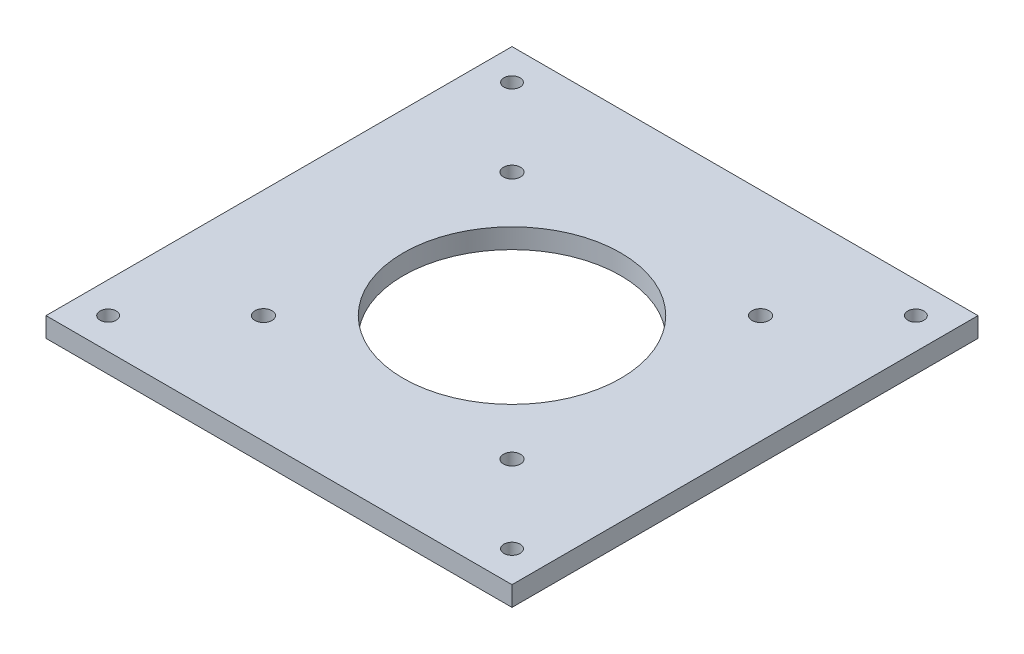
ISO-10303-21;
HEADER;
FILE_DESCRIPTION(('STEP AP214'),'2;1');
FILE_NAME('part.step','',(''),(''),'','','');
FILE_SCHEMA(('AUTOMOTIVE_DESIGN { 1 0 10303 214 1 1 1 1 }'));
ENDSEC;
DATA;
#1=APPLICATION_CONTEXT('core data for automotive mechanical design processes');
#2=APPLICATION_PROTOCOL_DEFINITION('international standard','automotive_design',2000,#1);
#3=PRODUCT_CONTEXT('',#1,'mechanical');
#4=PRODUCT('Part','Part','',(#3));
#5=PRODUCT_RELATED_PRODUCT_CATEGORY('part','',(#4));
#6=PRODUCT_DEFINITION_FORMATION('','',#4);
#7=PRODUCT_DEFINITION_CONTEXT('part definition',#1,'design');
#8=PRODUCT_DEFINITION('design','',#6,#7);
#9=PRODUCT_DEFINITION_SHAPE('','',#8);
#10=(LENGTH_UNIT() NAMED_UNIT(*) SI_UNIT(.MILLI.,.METRE.));
#11=(NAMED_UNIT(*) PLANE_ANGLE_UNIT() SI_UNIT($,.RADIAN.));
#12=(NAMED_UNIT(*) SI_UNIT($,.STERADIAN.) SOLID_ANGLE_UNIT());
#13=UNCERTAINTY_MEASURE_WITH_UNIT(LENGTH_MEASURE(1.E-05),#10,'distance_accuracy_value','');
#14=(GEOMETRIC_REPRESENTATION_CONTEXT(3) GLOBAL_UNCERTAINTY_ASSIGNED_CONTEXT((#13)) GLOBAL_UNIT_ASSIGNED_CONTEXT((#10,
#11,#12)) REPRESENTATION_CONTEXT('',''));
#15=CARTESIAN_POINT('',(0.,0.,0.));
#16=DIRECTION('',(0.,0.,1.));
#17=DIRECTION('',(1.,0.,0.));
#18=AXIS2_PLACEMENT_3D('',#15,#16,#17);
#19=CARTESIAN_POINT('',(0.,6.35,0.));
#20=DIRECTION('',(0.,1.,0.));
#21=DIRECTION('',(0.,0.,1.));
#22=AXIS2_PLACEMENT_3D('',#19,#20,#21);
#23=PLANE('',#22);
#24=CARTESIAN_POINT('',(-40.,6.35,40.));
#25=DIRECTION('',(0.,1.,0.));
#26=DIRECTION('',(0.,0.,-1.));
#27=AXIS2_PLACEMENT_3D('',#24,#25,#26);
#28=CIRCLE('',#27,2.74999999999999);
#29=CARTESIAN_POINT('',(-40.,6.35,37.25));
#30=VERTEX_POINT('',#29);
#31=EDGE_CURVE('E151',#30,#30,#28,.T.);
#32=ORIENTED_EDGE('',*,*,#31,.F.);
#33=EDGE_LOOP('',(#32));
#34=FACE_BOUND('',#33,.T.);
#35=CARTESIAN_POINT('',(40.,6.35,-40.));
#36=DIRECTION('',(0.,1.,0.));
#37=DIRECTION('',(0.,0.,-1.));
#38=AXIS2_PLACEMENT_3D('',#35,#36,#37);
#39=CIRCLE('',#38,2.75);
#40=CARTESIAN_POINT('',(40.,6.35,-42.75));
#41=VERTEX_POINT('',#40);
#42=EDGE_CURVE('E139',#41,#41,#39,.T.);
#43=ORIENTED_EDGE('',*,*,#42,.F.);
#44=EDGE_LOOP('',(#43));
#45=FACE_BOUND('',#44,.T.);
#46=CARTESIAN_POINT('',(-65.,6.35,65.));
#47=DIRECTION('',(0.,1.,0.));
#48=DIRECTION('',(0.,0.,-1.));
#49=AXIS2_PLACEMENT_3D('',#46,#47,#48);
#50=CIRCLE('',#49,2.59999999999999);
#51=CARTESIAN_POINT('',(-65.,6.35,62.4));
#52=VERTEX_POINT('',#51);
#53=EDGE_CURVE('E127',#52,#52,#50,.T.);
#54=ORIENTED_EDGE('',*,*,#53,.F.);
#55=EDGE_LOOP('',(#54));
#56=FACE_BOUND('',#55,.T.);
#57=CARTESIAN_POINT('',(65.,6.35,-65.));
#58=DIRECTION('',(0.,1.,0.));
#59=DIRECTION('',(0.,0.,-1.));
#60=AXIS2_PLACEMENT_3D('',#57,#58,#59);
#61=CIRCLE('',#60,2.59999999999999);
#62=CARTESIAN_POINT('',(65.,6.35,-67.6));
#63=VERTEX_POINT('',#62);
#64=EDGE_CURVE('E115',#63,#63,#61,.T.);
#65=ORIENTED_EDGE('',*,*,#64,.F.);
#66=EDGE_LOOP('',(#65));
#67=FACE_BOUND('',#66,.T.);
#68=DIRECTION('',(0.,0.,1.));
#69=VECTOR('',#68,1.);
#70=CARTESIAN_POINT('',(-75.,6.35,75.));
#71=LINE('',#70,#69);
#72=CARTESIAN_POINT('',(-75.,6.35,-75.));
#73=VERTEX_POINT('',#72);
#74=CARTESIAN_POINT('',(-75.,6.35,75.));
#75=VERTEX_POINT('',#74);
#76=EDGE_CURVE('E85',#73,#75,#71,.T.);
#77=ORIENTED_EDGE('',*,*,#76,.T.);
#78=DIRECTION('',(1.,0.,0.));
#79=VECTOR('',#78,1.);
#80=CARTESIAN_POINT('',(75.,6.35,75.));
#81=LINE('',#80,#79);
#82=CARTESIAN_POINT('',(75.,6.35,75.));
#83=VERTEX_POINT('',#82);
#84=EDGE_CURVE('E80',#75,#83,#81,.T.);
#85=ORIENTED_EDGE('',*,*,#84,.T.);
#86=DIRECTION('',(0.,0.,-1.));
#87=VECTOR('',#86,1.);
#88=CARTESIAN_POINT('',(75.,6.35,75.));
#89=LINE('',#88,#87);
#90=CARTESIAN_POINT('',(75.,6.35,-75.));
#91=VERTEX_POINT('',#90);
#92=EDGE_CURVE('E83',#83,#91,#89,.T.);
#93=ORIENTED_EDGE('',*,*,#92,.T.);
#94=DIRECTION('',(-1.,0.,0.));
#95=VECTOR('',#94,1.);
#96=CARTESIAN_POINT('',(75.,6.35,-75.));
#97=LINE('',#96,#95);
#98=EDGE_CURVE('E50',#91,#73,#97,.T.);
#99=ORIENTED_EDGE('',*,*,#98,.T.);
#100=EDGE_LOOP('',(#77,#85,#93,#99));
#101=FACE_BOUND('',#100,.T.);
#102=CARTESIAN_POINT('',(-65.,6.35,-65.));
#103=DIRECTION('',(0.,1.,0.));
#104=DIRECTION('',(0.,0.,1.));
#105=AXIS2_PLACEMENT_3D('',#102,#103,#104);
#106=CIRCLE('',#105,2.59999999999999);
#107=CARTESIAN_POINT('',(-65.,6.35,-62.4));
#108=VERTEX_POINT('',#107);
#109=EDGE_CURVE('E100',#108,#108,#106,.T.);
#110=ORIENTED_EDGE('',*,*,#109,.F.);
#111=EDGE_LOOP('',(#110));
#112=FACE_BOUND('',#111,.T.);
#113=CARTESIAN_POINT('',(65.,6.35,65.));
#114=DIRECTION('',(0.,1.,0.));
#115=DIRECTION('',(0.,0.,1.));
#116=AXIS2_PLACEMENT_3D('',#113,#114,#115);
#117=CIRCLE('',#116,2.59999999999999);
#118=CARTESIAN_POINT('',(65.,6.35,67.6));
#119=VERTEX_POINT('',#118);
#120=EDGE_CURVE('E121',#119,#119,#117,.T.);
#121=ORIENTED_EDGE('',*,*,#120,.F.);
#122=EDGE_LOOP('',(#121));
#123=FACE_BOUND('',#122,.T.);
#124=CARTESIAN_POINT('',(-40.,6.35,-40.));
#125=DIRECTION('',(0.,1.,0.));
#126=DIRECTION('',(0.,0.,1.));
#127=AXIS2_PLACEMENT_3D('',#124,#125,#126);
#128=CIRCLE('',#127,2.74999999999999);
#129=CARTESIAN_POINT('',(-40.,6.35,-37.25));
#130=VERTEX_POINT('',#129);
#131=EDGE_CURVE('E133',#130,#130,#128,.T.);
#132=ORIENTED_EDGE('',*,*,#131,.F.);
#133=EDGE_LOOP('',(#132));
#134=FACE_BOUND('',#133,.T.);
#135=CARTESIAN_POINT('',(40.,6.35,40.));
#136=DIRECTION('',(0.,1.,0.));
#137=DIRECTION('',(0.,0.,1.));
#138=AXIS2_PLACEMENT_3D('',#135,#136,#137);
#139=CIRCLE('',#138,2.75);
#140=CARTESIAN_POINT('',(40.,6.35,42.75));
#141=VERTEX_POINT('',#140);
#142=EDGE_CURVE('E145',#141,#141,#139,.T.);
#143=ORIENTED_EDGE('',*,*,#142,.F.);
#144=EDGE_LOOP('',(#143));
#145=FACE_BOUND('',#144,.T.);
#146=CARTESIAN_POINT('',(0.,6.35,0.));
#147=DIRECTION('',(0.,1.,0.));
#148=DIRECTION('',(0.,0.,1.));
#149=AXIS2_PLACEMENT_3D('',#146,#147,#148);
#150=CIRCLE('',#149,35.);
#151=CARTESIAN_POINT('',(0.,6.35,35.));
#152=VERTEX_POINT('',#151);
#153=EDGE_CURVE('E157',#152,#152,#150,.T.);
#154=ORIENTED_EDGE('',*,*,#153,.F.);
#155=EDGE_LOOP('',(#154));
#156=FACE_BOUND('',#155,.T.);
#157=ADVANCED_FACE('F33',(#34,#45,#56,#67,#101,#112,#123,#134,#145,#156),#23,.T.);
#158=CARTESIAN_POINT('',(0.,0.,0.));
#159=DIRECTION('',(0.,1.,0.));
#160=DIRECTION('',(0.,0.,1.));
#161=AXIS2_PLACEMENT_3D('',#158,#159,#160);
#162=PLANE('',#161);
#163=CARTESIAN_POINT('',(-40.,0.,40.));
#164=DIRECTION('',(0.,1.,0.));
#165=DIRECTION('',(0.,0.,-1.));
#166=AXIS2_PLACEMENT_3D('',#163,#164,#165);
#167=CIRCLE('',#166,2.74999999999999);
#168=CARTESIAN_POINT('',(-40.,0.,37.25));
#169=VERTEX_POINT('',#168);
#170=EDGE_CURVE('E154',#169,#169,#167,.T.);
#171=ORIENTED_EDGE('',*,*,#170,.T.);
#172=EDGE_LOOP('',(#171));
#173=FACE_BOUND('',#172,.T.);
#174=CARTESIAN_POINT('',(40.,0.,-40.));
#175=DIRECTION('',(0.,1.,0.));
#176=DIRECTION('',(0.,0.,-1.));
#177=AXIS2_PLACEMENT_3D('',#174,#175,#176);
#178=CIRCLE('',#177,2.75);
#179=CARTESIAN_POINT('',(40.,0.,-42.75));
#180=VERTEX_POINT('',#179);
#181=EDGE_CURVE('E142',#180,#180,#178,.T.);
#182=ORIENTED_EDGE('',*,*,#181,.T.);
#183=EDGE_LOOP('',(#182));
#184=FACE_BOUND('',#183,.T.);
#185=CARTESIAN_POINT('',(-65.,0.,65.));
#186=DIRECTION('',(0.,1.,0.));
#187=DIRECTION('',(0.,0.,-1.));
#188=AXIS2_PLACEMENT_3D('',#185,#186,#187);
#189=CIRCLE('',#188,2.59999999999999);
#190=CARTESIAN_POINT('',(-65.,0.,62.4));
#191=VERTEX_POINT('',#190);
#192=EDGE_CURVE('E130',#191,#191,#189,.T.);
#193=ORIENTED_EDGE('',*,*,#192,.T.);
#194=EDGE_LOOP('',(#193));
#195=FACE_BOUND('',#194,.T.);
#196=CARTESIAN_POINT('',(65.,0.,-65.));
#197=DIRECTION('',(0.,1.,0.));
#198=DIRECTION('',(0.,0.,-1.));
#199=AXIS2_PLACEMENT_3D('',#196,#197,#198);
#200=CIRCLE('',#199,2.59999999999999);
#201=CARTESIAN_POINT('',(65.,0.,-67.6));
#202=VERTEX_POINT('',#201);
#203=EDGE_CURVE('E118',#202,#202,#200,.T.);
#204=ORIENTED_EDGE('',*,*,#203,.T.);
#205=EDGE_LOOP('',(#204));
#206=FACE_BOUND('',#205,.T.);
#207=DIRECTION('',(0.,0.,1.));
#208=VECTOR('',#207,1.);
#209=CARTESIAN_POINT('',(-75.,0.,75.));
#210=LINE('',#209,#208);
#211=CARTESIAN_POINT('',(-75.,0.,-75.));
#212=VERTEX_POINT('',#211);
#213=CARTESIAN_POINT('',(-75.,0.,75.));
#214=VERTEX_POINT('',#213);
#215=EDGE_CURVE('E97',#212,#214,#210,.T.);
#216=ORIENTED_EDGE('',*,*,#215,.F.);
#217=DIRECTION('',(-1.,0.,0.));
#218=VECTOR('',#217,1.);
#219=CARTESIAN_POINT('',(75.,0.,-75.));
#220=LINE('',#219,#218);
#221=CARTESIAN_POINT('',(75.,0.,-75.));
#222=VERTEX_POINT('',#221);
#223=EDGE_CURVE('E73',#222,#212,#220,.T.);
#224=ORIENTED_EDGE('',*,*,#223,.F.);
#225=DIRECTION('',(0.,0.,-1.));
#226=VECTOR('',#225,1.);
#227=CARTESIAN_POINT('',(75.,0.,75.));
#228=LINE('',#227,#226);
#229=CARTESIAN_POINT('',(75.,0.,75.));
#230=VERTEX_POINT('',#229);
#231=EDGE_CURVE('E67',#230,#222,#228,.T.);
#232=ORIENTED_EDGE('',*,*,#231,.F.);
#233=DIRECTION('',(1.,0.,0.));
#234=VECTOR('',#233,1.);
#235=CARTESIAN_POINT('',(75.,0.,75.));
#236=LINE('',#235,#234);
#237=EDGE_CURVE('E89',#214,#230,#236,.T.);
#238=ORIENTED_EDGE('',*,*,#237,.F.);
#239=EDGE_LOOP('',(#216,#224,#232,#238));
#240=FACE_BOUND('',#239,.T.);
#241=CARTESIAN_POINT('',(-65.,0.,-65.));
#242=DIRECTION('',(0.,1.,0.));
#243=DIRECTION('',(0.,0.,1.));
#244=AXIS2_PLACEMENT_3D('',#241,#242,#243);
#245=CIRCLE('',#244,2.59999999999999);
#246=CARTESIAN_POINT('',(-65.,0.,-62.4));
#247=VERTEX_POINT('',#246);
#248=EDGE_CURVE('E112',#247,#247,#245,.T.);
#249=ORIENTED_EDGE('',*,*,#248,.T.);
#250=EDGE_LOOP('',(#249));
#251=FACE_BOUND('',#250,.T.);
#252=CARTESIAN_POINT('',(65.,0.,65.));
#253=DIRECTION('',(0.,1.,0.));
#254=DIRECTION('',(0.,0.,1.));
#255=AXIS2_PLACEMENT_3D('',#252,#253,#254);
#256=CIRCLE('',#255,2.59999999999999);
#257=CARTESIAN_POINT('',(65.,0.,67.6));
#258=VERTEX_POINT('',#257);
#259=EDGE_CURVE('E124',#258,#258,#256,.T.);
#260=ORIENTED_EDGE('',*,*,#259,.T.);
#261=EDGE_LOOP('',(#260));
#262=FACE_BOUND('',#261,.T.);
#263=CARTESIAN_POINT('',(-40.,0.,-40.));
#264=DIRECTION('',(0.,1.,0.));
#265=DIRECTION('',(0.,0.,1.));
#266=AXIS2_PLACEMENT_3D('',#263,#264,#265);
#267=CIRCLE('',#266,2.74999999999999);
#268=CARTESIAN_POINT('',(-40.,0.,-37.25));
#269=VERTEX_POINT('',#268);
#270=EDGE_CURVE('E136',#269,#269,#267,.T.);
#271=ORIENTED_EDGE('',*,*,#270,.T.);
#272=EDGE_LOOP('',(#271));
#273=FACE_BOUND('',#272,.T.);
#274=CARTESIAN_POINT('',(40.,0.,40.));
#275=DIRECTION('',(0.,1.,0.));
#276=DIRECTION('',(0.,0.,1.));
#277=AXIS2_PLACEMENT_3D('',#274,#275,#276);
#278=CIRCLE('',#277,2.75);
#279=CARTESIAN_POINT('',(40.,0.,42.75));
#280=VERTEX_POINT('',#279);
#281=EDGE_CURVE('E148',#280,#280,#278,.T.);
#282=ORIENTED_EDGE('',*,*,#281,.T.);
#283=EDGE_LOOP('',(#282));
#284=FACE_BOUND('',#283,.T.);
#285=CARTESIAN_POINT('',(0.,0.,0.));
#286=DIRECTION('',(0.,1.,0.));
#287=DIRECTION('',(0.,0.,1.));
#288=AXIS2_PLACEMENT_3D('',#285,#286,#287);
#289=CIRCLE('',#288,35.);
#290=CARTESIAN_POINT('',(0.,0.,35.));
#291=VERTEX_POINT('',#290);
#292=EDGE_CURVE('E160',#291,#291,#289,.T.);
#293=ORIENTED_EDGE('',*,*,#292,.T.);
#294=EDGE_LOOP('',(#293));
#295=FACE_BOUND('',#294,.T.);
#296=ADVANCED_FACE('F108',(#173,#184,#195,#206,#240,#251,#262,#273,#284,#295),#162,.F.);
#297=CARTESIAN_POINT('',(-75.,6.35,75.));
#298=DIRECTION('',(1.,0.,0.));
#299=DIRECTION('',(0.,0.,-1.));
#300=AXIS2_PLACEMENT_3D('',#297,#298,#299);
#301=PLANE('',#300);
#302=ORIENTED_EDGE('',*,*,#215,.T.);
#303=DIRECTION('',(0.,-1.,0.));
#304=VECTOR('',#303,1.);
#305=CARTESIAN_POINT('',(-75.,6.35,75.));
#306=LINE('',#305,#304);
#307=EDGE_CURVE('E11',#75,#214,#306,.T.);
#308=ORIENTED_EDGE('',*,*,#307,.F.);
#309=ORIENTED_EDGE('',*,*,#76,.F.);
#310=DIRECTION('',(0.,-1.,0.));
#311=VECTOR('',#310,1.);
#312=CARTESIAN_POINT('',(-75.,6.35,-75.));
#313=LINE('',#312,#311);
#314=EDGE_CURVE('E93',#73,#212,#313,.T.);
#315=ORIENTED_EDGE('',*,*,#314,.T.);
#316=EDGE_LOOP('',(#302,#308,#309,#315));
#317=FACE_BOUND('',#316,.T.);
#318=ADVANCED_FACE('F35',(#317),#301,.F.);
#319=CARTESIAN_POINT('',(75.,6.35,75.));
#320=DIRECTION('',(0.,0.,-1.));
#321=DIRECTION('',(-1.,0.,0.));
#322=AXIS2_PLACEMENT_3D('',#319,#320,#321);
#323=PLANE('',#322);
#324=ORIENTED_EDGE('',*,*,#237,.T.);
#325=DIRECTION('',(0.,-1.,0.));
#326=VECTOR('',#325,1.);
#327=CARTESIAN_POINT('',(75.,6.35,75.));
#328=LINE('',#327,#326);
#329=EDGE_CURVE('E42',#83,#230,#328,.T.);
#330=ORIENTED_EDGE('',*,*,#329,.F.);
#331=ORIENTED_EDGE('',*,*,#84,.F.);
#332=ORIENTED_EDGE('',*,*,#307,.T.);
#333=EDGE_LOOP('',(#324,#330,#331,#332));
#334=FACE_BOUND('',#333,.T.);
#335=ADVANCED_FACE('F88',(#334),#323,.F.);
#336=CARTESIAN_POINT('',(75.,6.35,75.));
#337=DIRECTION('',(-1.,0.,0.));
#338=DIRECTION('',(0.,0.,1.));
#339=AXIS2_PLACEMENT_3D('',#336,#337,#338);
#340=PLANE('',#339);
#341=ORIENTED_EDGE('',*,*,#231,.T.);
#342=DIRECTION('',(0.,-1.,0.));
#343=VECTOR('',#342,1.);
#344=CARTESIAN_POINT('',(75.,6.35,-75.));
#345=LINE('',#344,#343);
#346=EDGE_CURVE('E90',#91,#222,#345,.T.);
#347=ORIENTED_EDGE('',*,*,#346,.F.);
#348=ORIENTED_EDGE('',*,*,#92,.F.);
#349=ORIENTED_EDGE('',*,*,#329,.T.);
#350=EDGE_LOOP('',(#341,#347,#348,#349));
#351=FACE_BOUND('',#350,.T.);
#352=ADVANCED_FACE('F91',(#351),#340,.F.);
#353=CARTESIAN_POINT('',(75.,6.35,-75.));
#354=DIRECTION('',(0.,0.,1.));
#355=DIRECTION('',(1.,0.,0.));
#356=AXIS2_PLACEMENT_3D('',#353,#354,#355);
#357=PLANE('',#356);
#358=ORIENTED_EDGE('',*,*,#223,.T.);
#359=ORIENTED_EDGE('',*,*,#314,.F.);
#360=ORIENTED_EDGE('',*,*,#98,.F.);
#361=ORIENTED_EDGE('',*,*,#346,.T.);
#362=EDGE_LOOP('',(#358,#359,#360,#361));
#363=FACE_BOUND('',#362,.T.);
#364=ADVANCED_FACE('F105',(#363),#357,.F.);
#365=CARTESIAN_POINT('',(-65.,6.35,-65.));
#366=DIRECTION('',(0.,-1.,0.));
#367=DIRECTION('',(0.,0.,-1.));
#368=AXIS2_PLACEMENT_3D('',#365,#366,#367);
#369=CYLINDRICAL_SURFACE('',#368,2.59999999999999);
#370=ORIENTED_EDGE('',*,*,#109,.T.);
#371=EDGE_LOOP('',(#370));
#372=FACE_BOUND('',#371,.T.);
#373=ORIENTED_EDGE('',*,*,#248,.F.);
#374=EDGE_LOOP('',(#373));
#375=FACE_BOUND('',#374,.T.);
#376=ADVANCED_FACE('F180',(#372,#375),#369,.F.);
#377=CARTESIAN_POINT('',(65.,6.35,-65.));
#378=DIRECTION('',(0.,-1.,0.));
#379=DIRECTION('',(0.,0.,-1.));
#380=AXIS2_PLACEMENT_3D('',#377,#378,#379);
#381=CYLINDRICAL_SURFACE('',#380,2.59999999999999);
#382=ORIENTED_EDGE('',*,*,#64,.T.);
#383=EDGE_LOOP('',(#382));
#384=FACE_BOUND('',#383,.T.);
#385=ORIENTED_EDGE('',*,*,#203,.F.);
#386=EDGE_LOOP('',(#385));
#387=FACE_BOUND('',#386,.T.);
#388=ADVANCED_FACE('F226',(#384,#387),#381,.F.);
#389=CARTESIAN_POINT('',(65.,6.35,65.));
#390=DIRECTION('',(0.,-1.,0.));
#391=DIRECTION('',(0.,0.,-1.));
#392=AXIS2_PLACEMENT_3D('',#389,#390,#391);
#393=CYLINDRICAL_SURFACE('',#392,2.59999999999999);
#394=ORIENTED_EDGE('',*,*,#120,.T.);
#395=EDGE_LOOP('',(#394));
#396=FACE_BOUND('',#395,.T.);
#397=ORIENTED_EDGE('',*,*,#259,.F.);
#398=EDGE_LOOP('',(#397));
#399=FACE_BOUND('',#398,.T.);
#400=ADVANCED_FACE('F234',(#396,#399),#393,.F.);
#401=CARTESIAN_POINT('',(-65.,6.35,65.));
#402=DIRECTION('',(0.,-1.,0.));
#403=DIRECTION('',(0.,0.,-1.));
#404=AXIS2_PLACEMENT_3D('',#401,#402,#403);
#405=CYLINDRICAL_SURFACE('',#404,2.59999999999999);
#406=ORIENTED_EDGE('',*,*,#53,.T.);
#407=EDGE_LOOP('',(#406));
#408=FACE_BOUND('',#407,.T.);
#409=ORIENTED_EDGE('',*,*,#192,.F.);
#410=EDGE_LOOP('',(#409));
#411=FACE_BOUND('',#410,.T.);
#412=ADVANCED_FACE('F242',(#408,#411),#405,.F.);
#413=CARTESIAN_POINT('',(-40.,6.35,-40.));
#414=DIRECTION('',(0.,-1.,0.));
#415=DIRECTION('',(0.,0.,-1.));
#416=AXIS2_PLACEMENT_3D('',#413,#414,#415);
#417=CYLINDRICAL_SURFACE('',#416,2.74999999999999);
#418=ORIENTED_EDGE('',*,*,#131,.T.);
#419=EDGE_LOOP('',(#418));
#420=FACE_BOUND('',#419,.T.);
#421=ORIENTED_EDGE('',*,*,#270,.F.);
#422=EDGE_LOOP('',(#421));
#423=FACE_BOUND('',#422,.T.);
#424=ADVANCED_FACE('F251',(#420,#423),#417,.F.);
#425=CARTESIAN_POINT('',(40.,6.35,-40.));
#426=DIRECTION('',(0.,-1.,0.));
#427=DIRECTION('',(0.,0.,-1.));
#428=AXIS2_PLACEMENT_3D('',#425,#426,#427);
#429=CYLINDRICAL_SURFACE('',#428,2.75);
#430=ORIENTED_EDGE('',*,*,#42,.T.);
#431=EDGE_LOOP('',(#430));
#432=FACE_BOUND('',#431,.T.);
#433=ORIENTED_EDGE('',*,*,#181,.F.);
#434=EDGE_LOOP('',(#433));
#435=FACE_BOUND('',#434,.T.);
#436=ADVANCED_FACE('F260',(#432,#435),#429,.F.);
#437=CARTESIAN_POINT('',(40.,6.35,40.));
#438=DIRECTION('',(0.,-1.,0.));
#439=DIRECTION('',(0.,0.,-1.));
#440=AXIS2_PLACEMENT_3D('',#437,#438,#439);
#441=CYLINDRICAL_SURFACE('',#440,2.75);
#442=ORIENTED_EDGE('',*,*,#142,.T.);
#443=EDGE_LOOP('',(#442));
#444=FACE_BOUND('',#443,.T.);
#445=ORIENTED_EDGE('',*,*,#281,.F.);
#446=EDGE_LOOP('',(#445));
#447=FACE_BOUND('',#446,.T.);
#448=ADVANCED_FACE('F269',(#444,#447),#441,.F.);
#449=CARTESIAN_POINT('',(-40.,6.35,40.));
#450=DIRECTION('',(0.,-1.,0.));
#451=DIRECTION('',(0.,0.,-1.));
#452=AXIS2_PLACEMENT_3D('',#449,#450,#451);
#453=CYLINDRICAL_SURFACE('',#452,2.74999999999999);
#454=ORIENTED_EDGE('',*,*,#31,.T.);
#455=EDGE_LOOP('',(#454));
#456=FACE_BOUND('',#455,.T.);
#457=ORIENTED_EDGE('',*,*,#170,.F.);
#458=EDGE_LOOP('',(#457));
#459=FACE_BOUND('',#458,.T.);
#460=ADVANCED_FACE('F278',(#456,#459),#453,.F.);
#461=CARTESIAN_POINT('',(0.,6.35,0.));
#462=DIRECTION('',(0.,-1.,0.));
#463=DIRECTION('',(0.,0.,-1.));
#464=AXIS2_PLACEMENT_3D('',#461,#462,#463);
#465=CYLINDRICAL_SURFACE('',#464,35.);
#466=ORIENTED_EDGE('',*,*,#153,.T.);
#467=EDGE_LOOP('',(#466));
#468=FACE_BOUND('',#467,.T.);
#469=ORIENTED_EDGE('',*,*,#292,.F.);
#470=EDGE_LOOP('',(#469));
#471=FACE_BOUND('',#470,.T.);
#472=ADVANCED_FACE('F166',(#468,#471),#465,.F.);
#473=CLOSED_SHELL('',(#157,#296,#318,#335,#352,#364,#376,#388,#400,#412,#424,#436,#448,#460,#472));
#474=MANIFOLD_SOLID_BREP('B2',#473);
#475=ADVANCED_BREP_SHAPE_REPRESENTATION('',(#18,#474),#14);
#476=SHAPE_DEFINITION_REPRESENTATION(#9,#475);
ENDSEC;
END-ISO-10303-21;
